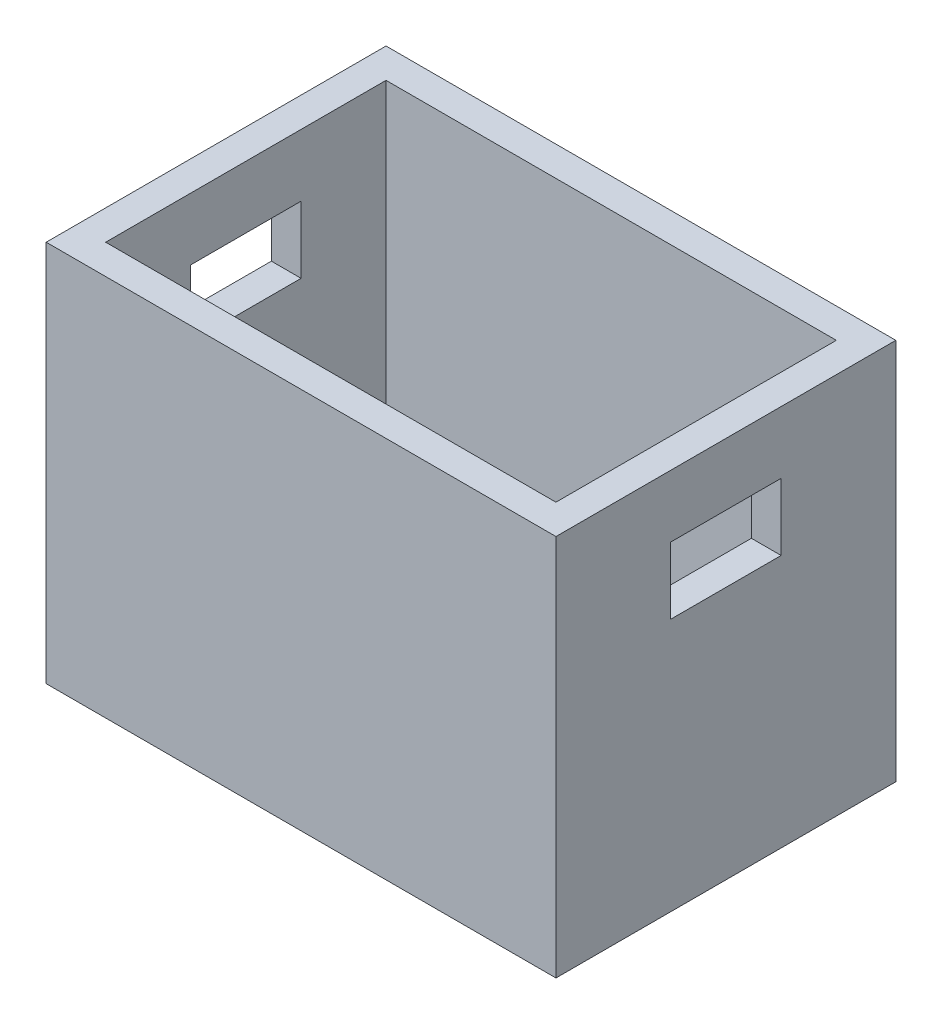
ISO-10303-21;
HEADER;
FILE_DESCRIPTION(('STEP AP214'),'2;1');
FILE_NAME('part.step','',(''),(''),'','','');
FILE_SCHEMA(('AUTOMOTIVE_DESIGN { 1 0 10303 214 1 1 1 1 }'));
ENDSEC;
DATA;
#1=APPLICATION_CONTEXT('core data for automotive mechanical design processes');
#2=APPLICATION_PROTOCOL_DEFINITION('international standard','automotive_design',2000,#1);
#3=PRODUCT_CONTEXT('',#1,'mechanical');
#4=PRODUCT('Part','Part','',(#3));
#5=PRODUCT_RELATED_PRODUCT_CATEGORY('part','',(#4));
#6=PRODUCT_DEFINITION_FORMATION('','',#4);
#7=PRODUCT_DEFINITION_CONTEXT('part definition',#1,'design');
#8=PRODUCT_DEFINITION('design','',#6,#7);
#9=PRODUCT_DEFINITION_SHAPE('','',#8);
#10=(LENGTH_UNIT() NAMED_UNIT(*) SI_UNIT(.MILLI.,.METRE.));
#11=(NAMED_UNIT(*) PLANE_ANGLE_UNIT() SI_UNIT($,.RADIAN.));
#12=(NAMED_UNIT(*) SI_UNIT($,.STERADIAN.) SOLID_ANGLE_UNIT());
#13=UNCERTAINTY_MEASURE_WITH_UNIT(LENGTH_MEASURE(1.E-05),#10,'distance_accuracy_value','');
#14=(GEOMETRIC_REPRESENTATION_CONTEXT(3) GLOBAL_UNCERTAINTY_ASSIGNED_CONTEXT((#13)) GLOBAL_UNIT_ASSIGNED_CONTEXT((#10,
#11,#12)) REPRESENTATION_CONTEXT('',''));
#15=CARTESIAN_POINT('',(0.,0.,0.));
#16=DIRECTION('',(0.,0.,1.));
#17=DIRECTION('',(1.,0.,0.));
#18=AXIS2_PLACEMENT_3D('',#15,#16,#17);
#19=CARTESIAN_POINT('',(0.,45.,0.));
#20=DIRECTION('',(0.,-1.,0.));
#21=DIRECTION('',(0.,0.,-1.));
#22=AXIS2_PLACEMENT_3D('',#19,#20,#21);
#23=PLANE('',#22);
#24=DIRECTION('',(0.,0.,-1.));
#25=VECTOR('',#24,1.);
#26=CARTESIAN_POINT('',(30.,45.,20.));
#27=LINE('',#26,#25);
#28=CARTESIAN_POINT('',(30.,45.,20.));
#29=VERTEX_POINT('',#28);
#30=CARTESIAN_POINT('',(30.,45.,-20.));
#31=VERTEX_POINT('',#30);
#32=EDGE_CURVE('E270',#29,#31,#27,.T.);
#33=ORIENTED_EDGE('',*,*,#32,.T.);
#34=DIRECTION('',(-1.,0.,0.));
#35=VECTOR('',#34,1.);
#36=CARTESIAN_POINT('',(-30.,45.,-20.));
#37=LINE('',#36,#35);
#38=CARTESIAN_POINT('',(-30.,45.,-20.));
#39=VERTEX_POINT('',#38);
#40=EDGE_CURVE('E274',#31,#39,#37,.T.);
#41=ORIENTED_EDGE('',*,*,#40,.T.);
#42=DIRECTION('',(0.,0.,1.));
#43=VECTOR('',#42,1.);
#44=CARTESIAN_POINT('',(-30.,45.,20.));
#45=LINE('',#44,#43);
#46=CARTESIAN_POINT('',(-30.,45.,20.));
#47=VERTEX_POINT('',#46);
#48=EDGE_CURVE('E278',#39,#47,#45,.T.);
#49=ORIENTED_EDGE('',*,*,#48,.T.);
#50=DIRECTION('',(1.,0.,0.));
#51=VECTOR('',#50,1.);
#52=CARTESIAN_POINT('',(-30.,45.,20.));
#53=LINE('',#52,#51);
#54=EDGE_CURVE('E281',#47,#29,#53,.T.);
#55=ORIENTED_EDGE('',*,*,#54,.T.);
#56=EDGE_LOOP('',(#33,#41,#49,#55));
#57=FACE_BOUND('',#56,.T.);
#58=DIRECTION('',(0.,0.,-1.));
#59=VECTOR('',#58,1.);
#60=CARTESIAN_POINT('',(26.5,45.,0.));
#61=LINE('',#60,#59);
#62=CARTESIAN_POINT('',(26.5,45.,16.5));
#63=VERTEX_POINT('',#62);
#64=CARTESIAN_POINT('',(26.5,45.,-16.5));
#65=VERTEX_POINT('',#64);
#66=EDGE_CURVE('E258',#63,#65,#61,.T.);
#67=ORIENTED_EDGE('',*,*,#66,.F.);
#68=DIRECTION('',(1.,0.,0.));
#69=VECTOR('',#68,1.);
#70=CARTESIAN_POINT('',(0.,45.,16.5));
#71=LINE('',#70,#69);
#72=CARTESIAN_POINT('',(-26.5,45.,16.5));
#73=VERTEX_POINT('',#72);
#74=EDGE_CURVE('E243',#73,#63,#71,.T.);
#75=ORIENTED_EDGE('',*,*,#74,.F.);
#76=DIRECTION('',(0.,0.,1.));
#77=VECTOR('',#76,1.);
#78=CARTESIAN_POINT('',(-26.5,45.,0.));
#79=LINE('',#78,#77);
#80=CARTESIAN_POINT('',(-26.5,45.,-16.5));
#81=VERTEX_POINT('',#80);
#82=EDGE_CURVE('E264',#81,#73,#79,.T.);
#83=ORIENTED_EDGE('',*,*,#82,.F.);
#84=DIRECTION('',(-1.,0.,0.));
#85=VECTOR('',#84,1.);
#86=CARTESIAN_POINT('',(0.,45.,-16.5));
#87=LINE('',#86,#85);
#88=EDGE_CURVE('E261',#65,#81,#87,.T.);
#89=ORIENTED_EDGE('',*,*,#88,.F.);
#90=EDGE_LOOP('',(#67,#75,#83,#89));
#91=FACE_BOUND('',#90,.T.);
#92=ADVANCED_FACE('F42',(#57,#91),#23,.F.);
#93=CARTESIAN_POINT('',(30.,45.,20.));
#94=DIRECTION('',(-1.,0.,0.));
#95=DIRECTION('',(0.,0.,1.));
#96=AXIS2_PLACEMENT_3D('',#93,#94,#95);
#97=PLANE('',#96);
#98=DIRECTION('',(0.,0.,1.));
#99=VECTOR('',#98,1.);
#100=CARTESIAN_POINT('',(30.,37.6831256797389,6.50388828467655));
#101=LINE('',#100,#99);
#102=CARTESIAN_POINT('',(30.,37.6831256797389,-6.50388828467656));
#103=VERTEX_POINT('',#102);
#104=CARTESIAN_POINT('',(30.,37.6831256797389,6.50388828467655));
#105=VERTEX_POINT('',#104);
#106=EDGE_CURVE('E196',#103,#105,#101,.T.);
#107=ORIENTED_EDGE('',*,*,#106,.F.);
#108=DIRECTION('',(0.,1.,0.));
#109=VECTOR('',#108,1.);
#110=CARTESIAN_POINT('',(30.,37.6831256797389,-6.50388828467656));
#111=LINE('',#110,#109);
#112=CARTESIAN_POINT('',(30.,29.8168743202611,-6.50388828467656));
#113=VERTEX_POINT('',#112);
#114=EDGE_CURVE('E58',#113,#103,#111,.T.);
#115=ORIENTED_EDGE('',*,*,#114,.F.);
#116=DIRECTION('',(0.,0.,-1.));
#117=VECTOR('',#116,1.);
#118=CARTESIAN_POINT('',(30.,29.8168743202611,6.50388828467655));
#119=LINE('',#118,#117);
#120=CARTESIAN_POINT('',(30.,29.8168743202611,6.50388828467655));
#121=VERTEX_POINT('',#120);
#122=EDGE_CURVE('E183',#121,#113,#119,.T.);
#123=ORIENTED_EDGE('',*,*,#122,.F.);
#124=DIRECTION('',(0.,-1.,0.));
#125=VECTOR('',#124,1.);
#126=CARTESIAN_POINT('',(30.,37.6831256797389,6.50388828467655));
#127=LINE('',#126,#125);
#128=EDGE_CURVE('E187',#105,#121,#127,.T.);
#129=ORIENTED_EDGE('',*,*,#128,.F.);
#130=EDGE_LOOP('',(#107,#115,#123,#129));
#131=FACE_BOUND('',#130,.T.);
#132=DIRECTION('',(0.,0.,-1.));
#133=VECTOR('',#132,1.);
#134=CARTESIAN_POINT('',(30.,0.,20.));
#135=LINE('',#134,#133);
#136=CARTESIAN_POINT('',(30.,0.,20.));
#137=VERTEX_POINT('',#136);
#138=CARTESIAN_POINT('',(30.,0.,-20.));
#139=VERTEX_POINT('',#138);
#140=EDGE_CURVE('E236',#137,#139,#135,.T.);
#141=ORIENTED_EDGE('',*,*,#140,.T.);
#142=DIRECTION('',(0.,-1.,0.));
#143=VECTOR('',#142,1.);
#144=CARTESIAN_POINT('',(30.,45.,-20.));
#145=LINE('',#144,#143);
#146=EDGE_CURVE('E307',#31,#139,#145,.T.);
#147=ORIENTED_EDGE('',*,*,#146,.F.);
#148=ORIENTED_EDGE('',*,*,#32,.F.);
#149=DIRECTION('',(0.,-1.,0.));
#150=VECTOR('',#149,1.);
#151=CARTESIAN_POINT('',(30.,45.,20.));
#152=LINE('',#151,#150);
#153=EDGE_CURVE('E284',#29,#137,#152,.T.);
#154=ORIENTED_EDGE('',*,*,#153,.T.);
#155=EDGE_LOOP('',(#141,#147,#148,#154));
#156=FACE_BOUND('',#155,.T.);
#157=ADVANCED_FACE('F44',(#131,#156),#97,.F.);
#158=CARTESIAN_POINT('',(-30.,45.,-20.));
#159=DIRECTION('',(0.,0.,1.));
#160=DIRECTION('',(1.,0.,0.));
#161=AXIS2_PLACEMENT_3D('',#158,#159,#160);
#162=PLANE('',#161);
#163=DIRECTION('',(-1.,0.,0.));
#164=VECTOR('',#163,1.);
#165=CARTESIAN_POINT('',(-30.,0.,-20.));
#166=LINE('',#165,#164);
#167=CARTESIAN_POINT('',(-30.,0.,-20.));
#168=VERTEX_POINT('',#167);
#169=EDGE_CURVE('E288',#139,#168,#166,.T.);
#170=ORIENTED_EDGE('',*,*,#169,.T.);
#171=DIRECTION('',(0.,-1.,0.));
#172=VECTOR('',#171,1.);
#173=CARTESIAN_POINT('',(-30.,45.,-20.));
#174=LINE('',#173,#172);
#175=EDGE_CURVE('E303',#39,#168,#174,.T.);
#176=ORIENTED_EDGE('',*,*,#175,.F.);
#177=ORIENTED_EDGE('',*,*,#40,.F.);
#178=ORIENTED_EDGE('',*,*,#146,.T.);
#179=EDGE_LOOP('',(#170,#176,#177,#178));
#180=FACE_BOUND('',#179,.T.);
#181=ADVANCED_FACE('F346',(#180),#162,.F.);
#182=CARTESIAN_POINT('',(-30.,45.,20.));
#183=DIRECTION('',(1.,0.,0.));
#184=DIRECTION('',(0.,0.,-1.));
#185=AXIS2_PLACEMENT_3D('',#182,#183,#184);
#186=PLANE('',#185);
#187=DIRECTION('',(0.,0.,-1.));
#188=VECTOR('',#187,1.);
#189=CARTESIAN_POINT('',(-30.,29.8168743202611,6.50388828467655));
#190=LINE('',#189,#188);
#191=CARTESIAN_POINT('',(-30.,29.8168743202611,6.50388828467655));
#192=VERTEX_POINT('',#191);
#193=CARTESIAN_POINT('',(-30.,29.8168743202611,-6.50388828467656));
#194=VERTEX_POINT('',#193);
#195=EDGE_CURVE('E181',#192,#194,#190,.T.);
#196=ORIENTED_EDGE('',*,*,#195,.T.);
#197=DIRECTION('',(0.,1.,0.));
#198=VECTOR('',#197,1.);
#199=CARTESIAN_POINT('',(-30.,37.6831256797389,-6.50388828467656));
#200=LINE('',#199,#198);
#201=CARTESIAN_POINT('',(-30.,37.6831256797389,-6.50388828467656));
#202=VERTEX_POINT('',#201);
#203=EDGE_CURVE('E162',#194,#202,#200,.T.);
#204=ORIENTED_EDGE('',*,*,#203,.T.);
#205=DIRECTION('',(0.,0.,1.));
#206=VECTOR('',#205,1.);
#207=CARTESIAN_POINT('',(-30.,37.6831256797389,6.50388828467655));
#208=LINE('',#207,#206);
#209=CARTESIAN_POINT('',(-30.,37.6831256797389,6.50388828467655));
#210=VERTEX_POINT('',#209);
#211=EDGE_CURVE('E172',#202,#210,#208,.T.);
#212=ORIENTED_EDGE('',*,*,#211,.T.);
#213=DIRECTION('',(0.,-1.,0.));
#214=VECTOR('',#213,1.);
#215=CARTESIAN_POINT('',(-30.,37.6831256797389,6.50388828467655));
#216=LINE('',#215,#214);
#217=EDGE_CURVE('E66',#210,#192,#216,.T.);
#218=ORIENTED_EDGE('',*,*,#217,.T.);
#219=EDGE_LOOP('',(#196,#204,#212,#218));
#220=FACE_BOUND('',#219,.T.);
#221=DIRECTION('',(0.,0.,1.));
#222=VECTOR('',#221,1.);
#223=CARTESIAN_POINT('',(-30.,0.,20.));
#224=LINE('',#223,#222);
#225=CARTESIAN_POINT('',(-30.,0.,20.));
#226=VERTEX_POINT('',#225);
#227=EDGE_CURVE('E291',#168,#226,#224,.T.);
#228=ORIENTED_EDGE('',*,*,#227,.T.);
#229=DIRECTION('',(0.,-1.,0.));
#230=VECTOR('',#229,1.);
#231=CARTESIAN_POINT('',(-30.,45.,20.));
#232=LINE('',#231,#230);
#233=EDGE_CURVE('E299',#47,#226,#232,.T.);
#234=ORIENTED_EDGE('',*,*,#233,.F.);
#235=ORIENTED_EDGE('',*,*,#48,.F.);
#236=ORIENTED_EDGE('',*,*,#175,.T.);
#237=EDGE_LOOP('',(#228,#234,#235,#236));
#238=FACE_BOUND('',#237,.T.);
#239=ADVANCED_FACE('F178',(#220,#238),#186,.F.);
#240=CARTESIAN_POINT('',(-30.,45.,20.));
#241=DIRECTION('',(0.,0.,-1.));
#242=DIRECTION('',(-1.,0.,0.));
#243=AXIS2_PLACEMENT_3D('',#240,#241,#242);
#244=PLANE('',#243);
#245=DIRECTION('',(1.,0.,0.));
#246=VECTOR('',#245,1.);
#247=CARTESIAN_POINT('',(-30.,0.,20.));
#248=LINE('',#247,#246);
#249=EDGE_CURVE('E275',#226,#137,#248,.T.);
#250=ORIENTED_EDGE('',*,*,#249,.T.);
#251=ORIENTED_EDGE('',*,*,#153,.F.);
#252=ORIENTED_EDGE('',*,*,#54,.F.);
#253=ORIENTED_EDGE('',*,*,#233,.T.);
#254=EDGE_LOOP('',(#250,#251,#252,#253));
#255=FACE_BOUND('',#254,.T.);
#256=ADVANCED_FACE('F356',(#255),#244,.F.);
#257=CARTESIAN_POINT('',(0.,0.,0.));
#258=DIRECTION('',(0.,-1.,0.));
#259=DIRECTION('',(0.,0.,-1.));
#260=AXIS2_PLACEMENT_3D('',#257,#258,#259);
#261=PLANE('',#260);
#262=ORIENTED_EDGE('',*,*,#140,.F.);
#263=ORIENTED_EDGE('',*,*,#249,.F.);
#264=ORIENTED_EDGE('',*,*,#227,.F.);
#265=ORIENTED_EDGE('',*,*,#169,.F.);
#266=EDGE_LOOP('',(#262,#263,#264,#265));
#267=FACE_BOUND('',#266,.T.);
#268=ADVANCED_FACE('F352',(#267),#261,.T.);
#269=CARTESIAN_POINT('',(26.5,45.,20.));
#270=DIRECTION('',(-1.,0.,0.));
#271=DIRECTION('',(0.,0.,1.));
#272=AXIS2_PLACEMENT_3D('',#269,#270,#271);
#273=PLANE('',#272);
#274=DIRECTION('',(0.,-1.,0.));
#275=VECTOR('',#274,1.);
#276=CARTESIAN_POINT('',(26.5,45.,-6.50388828467656));
#277=LINE('',#276,#275);
#278=CARTESIAN_POINT('',(26.5,37.6831256797389,-6.50388828467656));
#279=VERTEX_POINT('',#278);
#280=CARTESIAN_POINT('',(26.5,29.8168743202611,-6.50388828467656));
#281=VERTEX_POINT('',#280);
#282=EDGE_CURVE('E224',#279,#281,#277,.T.);
#283=ORIENTED_EDGE('',*,*,#282,.F.);
#284=DIRECTION('',(0.,0.,-1.));
#285=VECTOR('',#284,1.);
#286=CARTESIAN_POINT('',(26.5,37.6831256797389,20.));
#287=LINE('',#286,#285);
#288=CARTESIAN_POINT('',(26.5,37.6831256797389,6.50388828467655));
#289=VERTEX_POINT('',#288);
#290=EDGE_CURVE('E206',#289,#279,#287,.T.);
#291=ORIENTED_EDGE('',*,*,#290,.F.);
#292=DIRECTION('',(0.,1.,0.));
#293=VECTOR('',#292,1.);
#294=CARTESIAN_POINT('',(26.5,45.,6.50388828467655));
#295=LINE('',#294,#293);
#296=CARTESIAN_POINT('',(26.5,29.8168743202611,6.50388828467655));
#297=VERTEX_POINT('',#296);
#298=EDGE_CURVE('E217',#297,#289,#295,.T.);
#299=ORIENTED_EDGE('',*,*,#298,.F.);
#300=DIRECTION('',(0.,0.,1.));
#301=VECTOR('',#300,1.);
#302=CARTESIAN_POINT('',(26.5,29.8168743202611,20.));
#303=LINE('',#302,#301);
#304=EDGE_CURVE('E221',#281,#297,#303,.T.);
#305=ORIENTED_EDGE('',*,*,#304,.F.);
#306=EDGE_LOOP('',(#283,#291,#299,#305));
#307=FACE_BOUND('',#306,.T.);
#308=DIRECTION('',(0.,0.,-1.));
#309=VECTOR('',#308,1.);
#310=CARTESIAN_POINT('',(26.5,3.5,0.));
#311=LINE('',#310,#309);
#312=CARTESIAN_POINT('',(26.5,3.5,16.5));
#313=VERTEX_POINT('',#312);
#314=CARTESIAN_POINT('',(26.5,3.5,-16.5));
#315=VERTEX_POINT('',#314);
#316=EDGE_CURVE('E227',#313,#315,#311,.T.);
#317=ORIENTED_EDGE('',*,*,#316,.F.);
#318=DIRECTION('',(0.,-1.,0.));
#319=VECTOR('',#318,1.);
#320=CARTESIAN_POINT('',(26.5,45.,16.5));
#321=LINE('',#320,#319);
#322=EDGE_CURVE('E238',#63,#313,#321,.T.);
#323=ORIENTED_EDGE('',*,*,#322,.F.);
#324=ORIENTED_EDGE('',*,*,#66,.T.);
#325=DIRECTION('',(0.,-1.,0.));
#326=VECTOR('',#325,1.);
#327=CARTESIAN_POINT('',(26.5,45.,-16.5));
#328=LINE('',#327,#326);
#329=EDGE_CURVE('E232',#65,#315,#328,.T.);
#330=ORIENTED_EDGE('',*,*,#329,.T.);
#331=EDGE_LOOP('',(#317,#323,#324,#330));
#332=FACE_BOUND('',#331,.T.);
#333=ADVANCED_FACE('F355',(#307,#332),#273,.T.);
#334=CARTESIAN_POINT('',(-30.,45.,-16.5));
#335=DIRECTION('',(0.,0.,1.));
#336=DIRECTION('',(1.,0.,0.));
#337=AXIS2_PLACEMENT_3D('',#334,#335,#336);
#338=PLANE('',#337);
#339=DIRECTION('',(-1.,0.,0.));
#340=VECTOR('',#339,1.);
#341=CARTESIAN_POINT('',(0.,3.5,-16.5));
#342=LINE('',#341,#340);
#343=CARTESIAN_POINT('',(-26.5,3.5,-16.5));
#344=VERTEX_POINT('',#343);
#345=EDGE_CURVE('E231',#315,#344,#342,.T.);
#346=ORIENTED_EDGE('',*,*,#345,.F.);
#347=ORIENTED_EDGE('',*,*,#329,.F.);
#348=ORIENTED_EDGE('',*,*,#88,.T.);
#349=DIRECTION('',(0.,-1.,0.));
#350=VECTOR('',#349,1.);
#351=CARTESIAN_POINT('',(-26.5,45.,-16.5));
#352=LINE('',#351,#350);
#353=EDGE_CURVE('E237',#81,#344,#352,.T.);
#354=ORIENTED_EDGE('',*,*,#353,.T.);
#355=EDGE_LOOP('',(#346,#347,#348,#354));
#356=FACE_BOUND('',#355,.T.);
#357=ADVANCED_FACE('F401',(#356),#338,.T.);
#358=CARTESIAN_POINT('',(-26.5,45.,20.));
#359=DIRECTION('',(1.,0.,0.));
#360=DIRECTION('',(0.,0.,-1.));
#361=AXIS2_PLACEMENT_3D('',#358,#359,#360);
#362=PLANE('',#361);
#363=DIRECTION('',(0.,1.,0.));
#364=VECTOR('',#363,1.);
#365=CARTESIAN_POINT('',(-26.5,45.,-6.50388828467656));
#366=LINE('',#365,#364);
#367=CARTESIAN_POINT('',(-26.5,29.8168743202611,-6.50388828467656));
#368=VERTEX_POINT('',#367);
#369=CARTESIAN_POINT('',(-26.5,37.6831256797389,-6.50388828467656));
#370=VERTEX_POINT('',#369);
#371=EDGE_CURVE('E11',#368,#370,#366,.T.);
#372=ORIENTED_EDGE('',*,*,#371,.F.);
#373=DIRECTION('',(0.,0.,-1.));
#374=VECTOR('',#373,1.);
#375=CARTESIAN_POINT('',(-26.5,29.8168743202611,20.));
#376=LINE('',#375,#374);
#377=CARTESIAN_POINT('',(-26.5,29.8168743202611,6.50388828467655));
#378=VERTEX_POINT('',#377);
#379=EDGE_CURVE('E51',#378,#368,#376,.T.);
#380=ORIENTED_EDGE('',*,*,#379,.F.);
#381=DIRECTION('',(0.,-1.,0.));
#382=VECTOR('',#381,1.);
#383=CARTESIAN_POINT('',(-26.5,45.,6.50388828467655));
#384=LINE('',#383,#382);
#385=CARTESIAN_POINT('',(-26.5,37.6831256797389,6.50388828467655));
#386=VERTEX_POINT('',#385);
#387=EDGE_CURVE('E314',#386,#378,#384,.T.);
#388=ORIENTED_EDGE('',*,*,#387,.F.);
#389=DIRECTION('',(0.,0.,1.));
#390=VECTOR('',#389,1.);
#391=CARTESIAN_POINT('',(-26.5,37.6831256797389,20.));
#392=LINE('',#391,#390);
#393=EDGE_CURVE('E311',#370,#386,#392,.T.);
#394=ORIENTED_EDGE('',*,*,#393,.F.);
#395=EDGE_LOOP('',(#372,#380,#388,#394));
#396=FACE_BOUND('',#395,.T.);
#397=DIRECTION('',(0.,0.,1.));
#398=VECTOR('',#397,1.);
#399=CARTESIAN_POINT('',(-26.5,3.5,0.));
#400=LINE('',#399,#398);
#401=CARTESIAN_POINT('',(-26.5,3.5,16.5));
#402=VERTEX_POINT('',#401);
#403=EDGE_CURVE('E246',#344,#402,#400,.T.);
#404=ORIENTED_EDGE('',*,*,#403,.F.);
#405=ORIENTED_EDGE('',*,*,#353,.F.);
#406=ORIENTED_EDGE('',*,*,#82,.T.);
#407=DIRECTION('',(0.,-1.,0.));
#408=VECTOR('',#407,1.);
#409=CARTESIAN_POINT('',(-26.5,45.,16.5));
#410=LINE('',#409,#408);
#411=EDGE_CURVE('E242',#73,#402,#410,.T.);
#412=ORIENTED_EDGE('',*,*,#411,.T.);
#413=EDGE_LOOP('',(#404,#405,#406,#412));
#414=FACE_BOUND('',#413,.T.);
#415=ADVANCED_FACE('F322',(#396,#414),#362,.T.);
#416=CARTESIAN_POINT('',(-30.,45.,16.5));
#417=DIRECTION('',(0.,0.,-1.));
#418=DIRECTION('',(-1.,0.,0.));
#419=AXIS2_PLACEMENT_3D('',#416,#417,#418);
#420=PLANE('',#419);
#421=DIRECTION('',(1.,0.,0.));
#422=VECTOR('',#421,1.);
#423=CARTESIAN_POINT('',(0.,3.5,16.5));
#424=LINE('',#423,#422);
#425=EDGE_CURVE('E252',#402,#313,#424,.T.);
#426=ORIENTED_EDGE('',*,*,#425,.F.);
#427=ORIENTED_EDGE('',*,*,#411,.F.);
#428=ORIENTED_EDGE('',*,*,#74,.T.);
#429=ORIENTED_EDGE('',*,*,#322,.T.);
#430=EDGE_LOOP('',(#426,#427,#428,#429));
#431=FACE_BOUND('',#430,.T.);
#432=ADVANCED_FACE('F421',(#431),#420,.T.);
#433=CARTESIAN_POINT('',(0.,3.5,0.));
#434=DIRECTION('',(0.,-1.,0.));
#435=DIRECTION('',(0.,0.,-1.));
#436=AXIS2_PLACEMENT_3D('',#433,#434,#435);
#437=PLANE('',#436);
#438=ORIENTED_EDGE('',*,*,#316,.T.);
#439=ORIENTED_EDGE('',*,*,#345,.T.);
#440=ORIENTED_EDGE('',*,*,#403,.T.);
#441=ORIENTED_EDGE('',*,*,#425,.T.);
#442=EDGE_LOOP('',(#438,#439,#440,#441));
#443=FACE_BOUND('',#442,.T.);
#444=ADVANCED_FACE('F334',(#443),#437,.F.);
#445=CARTESIAN_POINT('',(-30.,37.6831256797389,6.50388828467655));
#446=DIRECTION('',(0.,1.,0.));
#447=DIRECTION('',(0.,0.,1.));
#448=AXIS2_PLACEMENT_3D('',#445,#446,#447);
#449=PLANE('',#448);
#450=ORIENTED_EDGE('',*,*,#393,.T.);
#451=DIRECTION('',(1.,0.,0.));
#452=VECTOR('',#451,1.);
#453=CARTESIAN_POINT('',(-30.,37.6831256797389,6.50388828467655));
#454=LINE('',#453,#452);
#455=EDGE_CURVE('E174',#210,#386,#454,.T.);
#456=ORIENTED_EDGE('',*,*,#455,.F.);
#457=ORIENTED_EDGE('',*,*,#211,.F.);
#458=DIRECTION('',(1.,0.,0.));
#459=VECTOR('',#458,1.);
#460=CARTESIAN_POINT('',(-30.,37.6831256797389,-6.50388828467656));
#461=LINE('',#460,#459);
#462=EDGE_CURVE('E157',#202,#370,#461,.T.);
#463=ORIENTED_EDGE('',*,*,#462,.T.);
#464=EDGE_LOOP('',(#450,#456,#457,#463));
#465=FACE_BOUND('',#464,.T.);
#466=ADVANCED_FACE('F173',(#465),#449,.F.);
#467=CARTESIAN_POINT('',(-30.,37.6831256797389,6.50388828467655));
#468=DIRECTION('',(0.,0.,1.));
#469=DIRECTION('',(1.,0.,0.));
#470=AXIS2_PLACEMENT_3D('',#467,#468,#469);
#471=PLANE('',#470);
#472=ORIENTED_EDGE('',*,*,#387,.T.);
#473=DIRECTION('',(1.,0.,0.));
#474=VECTOR('',#473,1.);
#475=CARTESIAN_POINT('',(-30.,29.8168743202611,6.50388828467655));
#476=LINE('',#475,#474);
#477=EDGE_CURVE('E208',#192,#378,#476,.T.);
#478=ORIENTED_EDGE('',*,*,#477,.F.);
#479=ORIENTED_EDGE('',*,*,#217,.F.);
#480=ORIENTED_EDGE('',*,*,#455,.T.);
#481=EDGE_LOOP('',(#472,#478,#479,#480));
#482=FACE_BOUND('',#481,.T.);
#483=ADVANCED_FACE('F324',(#482),#471,.F.);
#484=CARTESIAN_POINT('',(-30.,29.8168743202611,6.50388828467655));
#485=DIRECTION('',(0.,-1.,0.));
#486=DIRECTION('',(0.,0.,-1.));
#487=AXIS2_PLACEMENT_3D('',#484,#485,#486);
#488=PLANE('',#487);
#489=ORIENTED_EDGE('',*,*,#379,.T.);
#490=DIRECTION('',(1.,0.,0.));
#491=VECTOR('',#490,1.);
#492=CARTESIAN_POINT('',(-30.,29.8168743202611,-6.50388828467656));
#493=LINE('',#492,#491);
#494=EDGE_CURVE('E203',#194,#368,#493,.T.);
#495=ORIENTED_EDGE('',*,*,#494,.F.);
#496=ORIENTED_EDGE('',*,*,#195,.F.);
#497=ORIENTED_EDGE('',*,*,#477,.T.);
#498=EDGE_LOOP('',(#489,#495,#496,#497));
#499=FACE_BOUND('',#498,.T.);
#500=ADVANCED_FACE('F319',(#499),#488,.F.);
#501=CARTESIAN_POINT('',(-30.,37.6831256797389,-6.50388828467656));
#502=DIRECTION('',(0.,0.,-1.));
#503=DIRECTION('',(-1.,0.,0.));
#504=AXIS2_PLACEMENT_3D('',#501,#502,#503);
#505=PLANE('',#504);
#506=ORIENTED_EDGE('',*,*,#371,.T.);
#507=ORIENTED_EDGE('',*,*,#462,.F.);
#508=ORIENTED_EDGE('',*,*,#203,.F.);
#509=ORIENTED_EDGE('',*,*,#494,.T.);
#510=EDGE_LOOP('',(#506,#507,#508,#509));
#511=FACE_BOUND('',#510,.T.);
#512=ADVANCED_FACE('F159',(#511),#505,.F.);
#513=ORIENTED_EDGE('',*,*,#282,.T.);
#514=EDGE_CURVE('E207',#281,#113,#493,.T.);
#515=ORIENTED_EDGE('',*,*,#514,.T.);
#516=ORIENTED_EDGE('',*,*,#114,.T.);
#517=EDGE_CURVE('E169',#279,#103,#461,.T.);
#518=ORIENTED_EDGE('',*,*,#517,.F.);
#519=EDGE_LOOP('',(#513,#515,#516,#518));
#520=FACE_BOUND('',#519,.T.);
#521=ADVANCED_FACE('F461',(#520),#505,.F.);
#522=ORIENTED_EDGE('',*,*,#304,.T.);
#523=EDGE_CURVE('E212',#297,#121,#476,.T.);
#524=ORIENTED_EDGE('',*,*,#523,.T.);
#525=ORIENTED_EDGE('',*,*,#122,.T.);
#526=ORIENTED_EDGE('',*,*,#514,.F.);
#527=EDGE_LOOP('',(#522,#524,#525,#526));
#528=FACE_BOUND('',#527,.T.);
#529=ADVANCED_FACE('F333',(#528),#488,.F.);
#530=ORIENTED_EDGE('',*,*,#298,.T.);
#531=EDGE_CURVE('E168',#289,#105,#454,.T.);
#532=ORIENTED_EDGE('',*,*,#531,.T.);
#533=ORIENTED_EDGE('',*,*,#128,.T.);
#534=ORIENTED_EDGE('',*,*,#523,.F.);
#535=EDGE_LOOP('',(#530,#532,#533,#534));
#536=FACE_BOUND('',#535,.T.);
#537=ADVANCED_FACE('F327',(#536),#471,.F.);
#538=ORIENTED_EDGE('',*,*,#290,.T.);
#539=ORIENTED_EDGE('',*,*,#517,.T.);
#540=ORIENTED_EDGE('',*,*,#106,.T.);
#541=ORIENTED_EDGE('',*,*,#531,.F.);
#542=EDGE_LOOP('',(#538,#539,#540,#541));
#543=FACE_BOUND('',#542,.T.);
#544=ADVANCED_FACE('F336',(#543),#449,.F.);
#545=CLOSED_SHELL('',(#92,#157,#181,#239,#256,#268,#333,#357,#415,#432,#444,#466,#483,#500,#512,
#521,#529,#537,#544));
#546=MANIFOLD_SOLID_BREP('B2',#545);
#547=ADVANCED_BREP_SHAPE_REPRESENTATION('',(#18,#546),#14);
#548=SHAPE_DEFINITION_REPRESENTATION(#9,#547);
ENDSEC;
END-ISO-10303-21;
